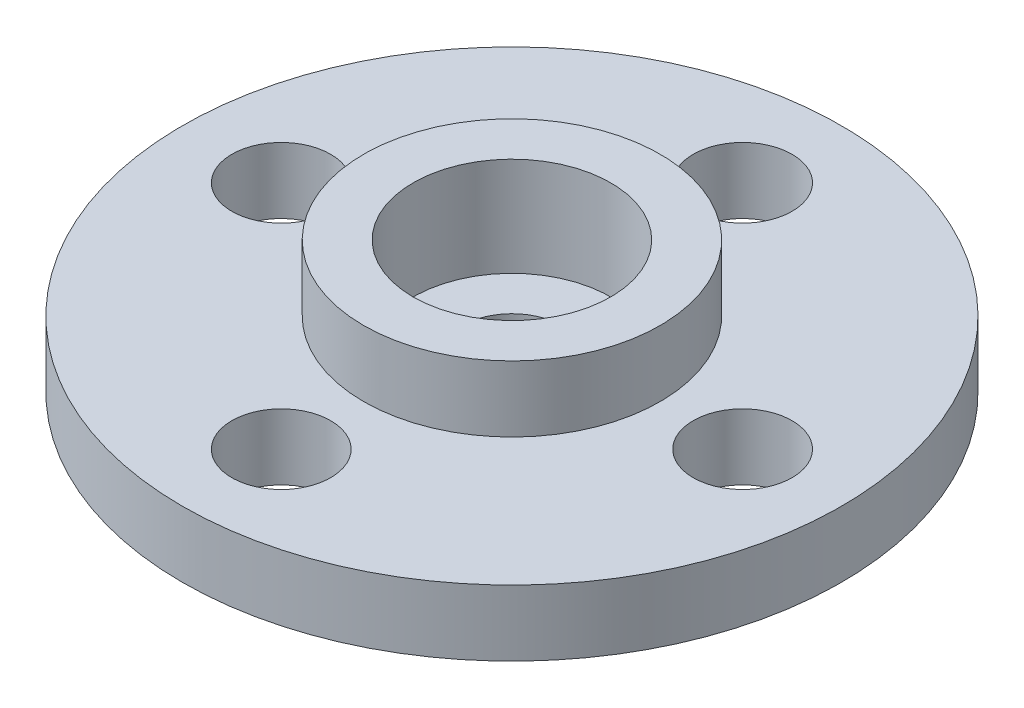
ISO-10303-21;
HEADER;
FILE_DESCRIPTION(('STEP AP214'),'2;1');
FILE_NAME('part.step','',(''),(''),'','','');
FILE_SCHEMA(('AUTOMOTIVE_DESIGN { 1 0 10303 214 1 1 1 1 }'));
ENDSEC;
DATA;
#1=APPLICATION_CONTEXT('core data for automotive mechanical design processes');
#2=APPLICATION_PROTOCOL_DEFINITION('international standard','automotive_design',2000,#1);
#3=PRODUCT_CONTEXT('',#1,'mechanical');
#4=PRODUCT('Part','Part','',(#3));
#5=PRODUCT_RELATED_PRODUCT_CATEGORY('part','',(#4));
#6=PRODUCT_DEFINITION_FORMATION('','',#4);
#7=PRODUCT_DEFINITION_CONTEXT('part definition',#1,'design');
#8=PRODUCT_DEFINITION('design','',#6,#7);
#9=PRODUCT_DEFINITION_SHAPE('','',#8);
#10=(LENGTH_UNIT() NAMED_UNIT(*) SI_UNIT(.MILLI.,.METRE.));
#11=(NAMED_UNIT(*) PLANE_ANGLE_UNIT() SI_UNIT($,.RADIAN.));
#12=(NAMED_UNIT(*) SI_UNIT($,.STERADIAN.) SOLID_ANGLE_UNIT());
#13=UNCERTAINTY_MEASURE_WITH_UNIT(LENGTH_MEASURE(1.E-05),#10,'distance_accuracy_value','');
#14=(GEOMETRIC_REPRESENTATION_CONTEXT(3) GLOBAL_UNCERTAINTY_ASSIGNED_CONTEXT((#13)) GLOBAL_UNIT_ASSIGNED_CONTEXT((#10,
#11,#12)) REPRESENTATION_CONTEXT('',''));
#15=CARTESIAN_POINT('',(0.,0.,0.));
#16=DIRECTION('',(0.,0.,1.));
#17=DIRECTION('',(1.,0.,0.));
#18=AXIS2_PLACEMENT_3D('',#15,#16,#17);
#19=CARTESIAN_POINT('',(0.,2.,0.));
#20=DIRECTION('',(0.,-1.,0.));
#21=DIRECTION('',(0.,0.,-1.));
#22=AXIS2_PLACEMENT_3D('',#19,#20,#21);
#23=CYLINDRICAL_SURFACE('',#22,10.);
#24=CARTESIAN_POINT('',(0.,2.,0.));
#25=DIRECTION('',(0.,1.,0.));
#26=DIRECTION('',(0.,0.,1.));
#27=AXIS2_PLACEMENT_3D('',#24,#25,#26);
#28=CIRCLE('',#27,10.);
#29=CARTESIAN_POINT('',(0.,2.,10.));
#30=VERTEX_POINT('',#29);
#31=EDGE_CURVE('E10',#30,#30,#28,.T.);
#32=ORIENTED_EDGE('',*,*,#31,.F.);
#33=EDGE_LOOP('',(#32));
#34=FACE_BOUND('',#33,.T.);
#35=CARTESIAN_POINT('',(0.,0.,0.));
#36=DIRECTION('',(0.,1.,0.));
#37=DIRECTION('',(0.,0.,1.));
#38=AXIS2_PLACEMENT_3D('',#35,#36,#37);
#39=CIRCLE('',#38,10.);
#40=CARTESIAN_POINT('',(0.,0.,10.));
#41=VERTEX_POINT('',#40);
#42=EDGE_CURVE('E40',#41,#41,#39,.T.);
#43=ORIENTED_EDGE('',*,*,#42,.T.);
#44=EDGE_LOOP('',(#43));
#45=FACE_BOUND('',#44,.T.);
#46=ADVANCED_FACE('F37',(#34,#45),#23,.T.);
#47=CARTESIAN_POINT('',(0.,2.,0.));
#48=DIRECTION('',(0.,1.,0.));
#49=DIRECTION('',(0.,0.,1.));
#50=AXIS2_PLACEMENT_3D('',#47,#48,#49);
#51=PLANE('',#50);
#52=CARTESIAN_POINT('',(-7.,2.,0.));
#53=DIRECTION('',(0.,1.,0.));
#54=DIRECTION('',(0.,0.,-1.));
#55=AXIS2_PLACEMENT_3D('',#52,#53,#54);
#56=CIRCLE('',#55,1.5);
#57=CARTESIAN_POINT('',(-7.,2.,-1.5));
#58=VERTEX_POINT('',#57);
#59=EDGE_CURVE('E85',#58,#58,#56,.T.);
#60=ORIENTED_EDGE('',*,*,#59,.F.);
#61=EDGE_LOOP('',(#60));
#62=FACE_BOUND('',#61,.T.);
#63=CARTESIAN_POINT('',(0.,2.,7.));
#64=DIRECTION('',(0.,1.,0.));
#65=DIRECTION('',(-1.,0.,0.));
#66=AXIS2_PLACEMENT_3D('',#63,#64,#65);
#67=CIRCLE('',#66,1.5);
#68=CARTESIAN_POINT('',(-1.49999999999993,2.,7.00000000000002));
#69=VERTEX_POINT('',#68);
#70=EDGE_CURVE('E79',#69,#69,#67,.T.);
#71=ORIENTED_EDGE('',*,*,#70,.F.);
#72=EDGE_LOOP('',(#71));
#73=FACE_BOUND('',#72,.T.);
#74=CARTESIAN_POINT('',(0.,2.,-7.));
#75=DIRECTION('',(0.,1.,0.));
#76=DIRECTION('',(1.,0.,0.));
#77=AXIS2_PLACEMENT_3D('',#74,#75,#76);
#78=CIRCLE('',#77,1.5);
#79=CARTESIAN_POINT('',(1.49999999999998,2.,-7.00000000000001));
#80=VERTEX_POINT('',#79);
#81=EDGE_CURVE('E73',#80,#80,#78,.T.);
#82=ORIENTED_EDGE('',*,*,#81,.F.);
#83=EDGE_LOOP('',(#82));
#84=FACE_BOUND('',#83,.T.);
#85=CARTESIAN_POINT('',(7.,2.,0.));
#86=DIRECTION('',(0.,1.,0.));
#87=DIRECTION('',(0.,0.,1.));
#88=AXIS2_PLACEMENT_3D('',#85,#86,#87);
#89=CIRCLE('',#88,1.5);
#90=CARTESIAN_POINT('',(7.,2.,1.5));
#91=VERTEX_POINT('',#90);
#92=EDGE_CURVE('E67',#91,#91,#89,.T.);
#93=ORIENTED_EDGE('',*,*,#92,.F.);
#94=EDGE_LOOP('',(#93));
#95=FACE_BOUND('',#94,.T.);
#96=CARTESIAN_POINT('',(0.,2.,0.));
#97=DIRECTION('',(0.,1.,0.));
#98=DIRECTION('',(0.,0.,1.));
#99=AXIS2_PLACEMENT_3D('',#96,#97,#98);
#100=CIRCLE('',#99,4.5);
#101=CARTESIAN_POINT('',(0.,2.,4.5));
#102=VERTEX_POINT('',#101);
#103=EDGE_CURVE('E49',#102,#102,#100,.T.);
#104=ORIENTED_EDGE('',*,*,#103,.F.);
#105=EDGE_LOOP('',(#104));
#106=FACE_BOUND('',#105,.T.);
#107=ORIENTED_EDGE('',*,*,#31,.T.);
#108=EDGE_LOOP('',(#107));
#109=FACE_BOUND('',#108,.T.);
#110=ADVANCED_FACE('F101',(#62,#73,#84,#95,#106,#109),#51,.T.);
#111=CARTESIAN_POINT('',(0.,0.,0.));
#112=DIRECTION('',(0.,1.,0.));
#113=DIRECTION('',(0.,0.,1.));
#114=AXIS2_PLACEMENT_3D('',#111,#112,#113);
#115=PLANE('',#114);
#116=CARTESIAN_POINT('',(-7.,0.,0.));
#117=DIRECTION('',(0.,1.,0.));
#118=DIRECTION('',(0.,0.,-1.));
#119=AXIS2_PLACEMENT_3D('',#116,#117,#118);
#120=CIRCLE('',#119,1.5);
#121=CARTESIAN_POINT('',(-7.,0.,-1.5));
#122=VERTEX_POINT('',#121);
#123=EDGE_CURVE('E76',#122,#122,#120,.T.);
#124=ORIENTED_EDGE('',*,*,#123,.T.);
#125=EDGE_LOOP('',(#124));
#126=FACE_BOUND('',#125,.T.);
#127=CARTESIAN_POINT('',(0.,0.,7.));
#128=DIRECTION('',(0.,1.,0.));
#129=DIRECTION('',(-1.,0.,0.));
#130=AXIS2_PLACEMENT_3D('',#127,#128,#129);
#131=CIRCLE('',#130,1.5);
#132=CARTESIAN_POINT('',(-1.49999999999993,0.,7.00000000000002));
#133=VERTEX_POINT('',#132);
#134=EDGE_CURVE('E82',#133,#133,#131,.T.);
#135=ORIENTED_EDGE('',*,*,#134,.T.);
#136=EDGE_LOOP('',(#135));
#137=FACE_BOUND('',#136,.T.);
#138=CARTESIAN_POINT('',(0.,0.,-7.));
#139=DIRECTION('',(0.,1.,0.));
#140=DIRECTION('',(1.,0.,0.));
#141=AXIS2_PLACEMENT_3D('',#138,#139,#140);
#142=CIRCLE('',#141,1.5);
#143=CARTESIAN_POINT('',(1.49999999999998,0.,-7.00000000000001));
#144=VERTEX_POINT('',#143);
#145=EDGE_CURVE('E70',#144,#144,#142,.T.);
#146=ORIENTED_EDGE('',*,*,#145,.T.);
#147=EDGE_LOOP('',(#146));
#148=FACE_BOUND('',#147,.T.);
#149=CARTESIAN_POINT('',(7.,0.,0.));
#150=DIRECTION('',(0.,1.,0.));
#151=DIRECTION('',(0.,0.,1.));
#152=AXIS2_PLACEMENT_3D('',#149,#150,#151);
#153=CIRCLE('',#152,1.5);
#154=CARTESIAN_POINT('',(7.,0.,1.5));
#155=VERTEX_POINT('',#154);
#156=EDGE_CURVE('E64',#155,#155,#153,.T.);
#157=ORIENTED_EDGE('',*,*,#156,.T.);
#158=EDGE_LOOP('',(#157));
#159=FACE_BOUND('',#158,.T.);
#160=CARTESIAN_POINT('',(0.,0.,0.));
#161=DIRECTION('',(0.,1.,0.));
#162=DIRECTION('',(0.,0.,1.));
#163=AXIS2_PLACEMENT_3D('',#160,#161,#162);
#164=CIRCLE('',#163,1.5);
#165=CARTESIAN_POINT('',(0.,0.,1.5));
#166=VERTEX_POINT('',#165);
#167=EDGE_CURVE('E58',#166,#166,#164,.T.);
#168=ORIENTED_EDGE('',*,*,#167,.T.);
#169=EDGE_LOOP('',(#168));
#170=FACE_BOUND('',#169,.T.);
#171=ORIENTED_EDGE('',*,*,#42,.F.);
#172=EDGE_LOOP('',(#171));
#173=FACE_BOUND('',#172,.T.);
#174=ADVANCED_FACE('F91',(#126,#137,#148,#159,#170,#173),#115,.F.);
#175=CARTESIAN_POINT('',(0.,4.,0.));
#176=DIRECTION('',(0.,-1.,0.));
#177=DIRECTION('',(0.,0.,-1.));
#178=AXIS2_PLACEMENT_3D('',#175,#176,#177);
#179=CYLINDRICAL_SURFACE('',#178,4.5);
#180=CARTESIAN_POINT('',(0.,4.,0.));
#181=DIRECTION('',(0.,1.,0.));
#182=DIRECTION('',(0.,0.,1.));
#183=AXIS2_PLACEMENT_3D('',#180,#181,#182);
#184=CIRCLE('',#183,4.5);
#185=CARTESIAN_POINT('',(0.,4.,4.5));
#186=VERTEX_POINT('',#185);
#187=EDGE_CURVE('E47',#186,#186,#184,.T.);
#188=ORIENTED_EDGE('',*,*,#187,.F.);
#189=EDGE_LOOP('',(#188));
#190=FACE_BOUND('',#189,.T.);
#191=ORIENTED_EDGE('',*,*,#103,.T.);
#192=EDGE_LOOP('',(#191));
#193=FACE_BOUND('',#192,.T.);
#194=ADVANCED_FACE('F113',(#190,#193),#179,.T.);
#195=CARTESIAN_POINT('',(0.,4.,0.));
#196=DIRECTION('',(0.,1.,0.));
#197=DIRECTION('',(0.,0.,1.));
#198=AXIS2_PLACEMENT_3D('',#195,#196,#197);
#199=PLANE('',#198);
#200=CARTESIAN_POINT('',(0.,4.,0.));
#201=DIRECTION('',(0.,1.,0.));
#202=DIRECTION('',(0.,0.,1.));
#203=AXIS2_PLACEMENT_3D('',#200,#201,#202);
#204=CIRCLE('',#203,3.);
#205=CARTESIAN_POINT('',(0.,4.,3.));
#206=VERTEX_POINT('',#205);
#207=EDGE_CURVE('E55',#206,#206,#204,.T.);
#208=ORIENTED_EDGE('',*,*,#207,.F.);
#209=EDGE_LOOP('',(#208));
#210=FACE_BOUND('',#209,.T.);
#211=ORIENTED_EDGE('',*,*,#187,.T.);
#212=EDGE_LOOP('',(#211));
#213=FACE_BOUND('',#212,.T.);
#214=ADVANCED_FACE('F115',(#210,#213),#199,.T.);
#215=CARTESIAN_POINT('',(0.,1.,0.));
#216=DIRECTION('',(0.,1.,0.));
#217=DIRECTION('',(0.,0.,1.));
#218=AXIS2_PLACEMENT_3D('',#215,#216,#217);
#219=CYLINDRICAL_SURFACE('',#218,3.);
#220=CARTESIAN_POINT('',(0.,1.,0.));
#221=DIRECTION('',(0.,1.,0.));
#222=DIRECTION('',(0.,0.,1.));
#223=AXIS2_PLACEMENT_3D('',#220,#221,#222);
#224=CIRCLE('',#223,3.);
#225=CARTESIAN_POINT('',(0.,1.,3.));
#226=VERTEX_POINT('',#225);
#227=EDGE_CURVE('E52',#226,#226,#224,.T.);
#228=ORIENTED_EDGE('',*,*,#227,.F.);
#229=EDGE_LOOP('',(#228));
#230=FACE_BOUND('',#229,.T.);
#231=ORIENTED_EDGE('',*,*,#207,.T.);
#232=EDGE_LOOP('',(#231));
#233=FACE_BOUND('',#232,.T.);
#234=ADVANCED_FACE('F122',(#230,#233),#219,.F.);
#235=CARTESIAN_POINT('',(0.,1.,0.));
#236=DIRECTION('',(0.,1.,0.));
#237=DIRECTION('',(0.,0.,1.));
#238=AXIS2_PLACEMENT_3D('',#235,#236,#237);
#239=PLANE('',#238);
#240=CARTESIAN_POINT('',(0.,1.,0.));
#241=DIRECTION('',(0.,1.,0.));
#242=DIRECTION('',(0.,0.,1.));
#243=AXIS2_PLACEMENT_3D('',#240,#241,#242);
#244=CIRCLE('',#243,1.5);
#245=CARTESIAN_POINT('',(0.,1.,1.5));
#246=VERTEX_POINT('',#245);
#247=EDGE_CURVE('E61',#246,#246,#244,.T.);
#248=ORIENTED_EDGE('',*,*,#247,.F.);
#249=EDGE_LOOP('',(#248));
#250=FACE_BOUND('',#249,.T.);
#251=ORIENTED_EDGE('',*,*,#227,.T.);
#252=EDGE_LOOP('',(#251));
#253=FACE_BOUND('',#252,.T.);
#254=ADVANCED_FACE('F183',(#250,#253),#239,.T.);
#255=CARTESIAN_POINT('',(0.,0.,0.));
#256=DIRECTION('',(0.,1.,0.));
#257=DIRECTION('',(0.,0.,1.));
#258=AXIS2_PLACEMENT_3D('',#255,#256,#257);
#259=CYLINDRICAL_SURFACE('',#258,1.5);
#260=ORIENTED_EDGE('',*,*,#167,.F.);
#261=EDGE_LOOP('',(#260));
#262=FACE_BOUND('',#261,.T.);
#263=ORIENTED_EDGE('',*,*,#247,.T.);
#264=EDGE_LOOP('',(#263));
#265=FACE_BOUND('',#264,.T.);
#266=ADVANCED_FACE('F179',(#262,#265),#259,.F.);
#267=CARTESIAN_POINT('',(7.,0.,0.));
#268=DIRECTION('',(0.,1.,0.));
#269=DIRECTION('',(0.,0.,1.));
#270=AXIS2_PLACEMENT_3D('',#267,#268,#269);
#271=CYLINDRICAL_SURFACE('',#270,1.5);
#272=ORIENTED_EDGE('',*,*,#156,.F.);
#273=EDGE_LOOP('',(#272));
#274=FACE_BOUND('',#273,.T.);
#275=ORIENTED_EDGE('',*,*,#92,.T.);
#276=EDGE_LOOP('',(#275));
#277=FACE_BOUND('',#276,.T.);
#278=ADVANCED_FACE('F153',(#274,#277),#271,.F.);
#279=CARTESIAN_POINT('',(0.,0.,-7.));
#280=DIRECTION('',(0.,1.,0.));
#281=DIRECTION('',(0.,0.,1.));
#282=AXIS2_PLACEMENT_3D('',#279,#280,#281);
#283=CYLINDRICAL_SURFACE('',#282,1.5);
#284=ORIENTED_EDGE('',*,*,#145,.F.);
#285=EDGE_LOOP('',(#284));
#286=FACE_BOUND('',#285,.T.);
#287=ORIENTED_EDGE('',*,*,#81,.T.);
#288=EDGE_LOOP('',(#287));
#289=FACE_BOUND('',#288,.T.);
#290=ADVANCED_FACE('F148',(#286,#289),#283,.F.);
#291=CARTESIAN_POINT('',(0.,0.,7.));
#292=DIRECTION('',(0.,1.,0.));
#293=DIRECTION('',(0.,0.,1.));
#294=AXIS2_PLACEMENT_3D('',#291,#292,#293);
#295=CYLINDRICAL_SURFACE('',#294,1.5);
#296=ORIENTED_EDGE('',*,*,#134,.F.);
#297=EDGE_LOOP('',(#296));
#298=FACE_BOUND('',#297,.T.);
#299=ORIENTED_EDGE('',*,*,#70,.T.);
#300=EDGE_LOOP('',(#299));
#301=FACE_BOUND('',#300,.T.);
#302=ADVANCED_FACE('F97',(#298,#301),#295,.F.);
#303=CARTESIAN_POINT('',(-7.,0.,0.));
#304=DIRECTION('',(0.,1.,0.));
#305=DIRECTION('',(0.,0.,1.));
#306=AXIS2_PLACEMENT_3D('',#303,#304,#305);
#307=CYLINDRICAL_SURFACE('',#306,1.5);
#308=ORIENTED_EDGE('',*,*,#123,.F.);
#309=EDGE_LOOP('',(#308));
#310=FACE_BOUND('',#309,.T.);
#311=ORIENTED_EDGE('',*,*,#59,.T.);
#312=EDGE_LOOP('',(#311));
#313=FACE_BOUND('',#312,.T.);
#314=ADVANCED_FACE('F94',(#310,#313),#307,.F.);
#315=CLOSED_SHELL('',(#46,#110,#174,#194,#214,#234,#254,#266,#278,#290,#302,#314));
#316=MANIFOLD_SOLID_BREP('B2',#315);
#317=ADVANCED_BREP_SHAPE_REPRESENTATION('',(#18,#316),#14);
#318=SHAPE_DEFINITION_REPRESENTATION(#9,#317);
ENDSEC;
END-ISO-10303-21;
